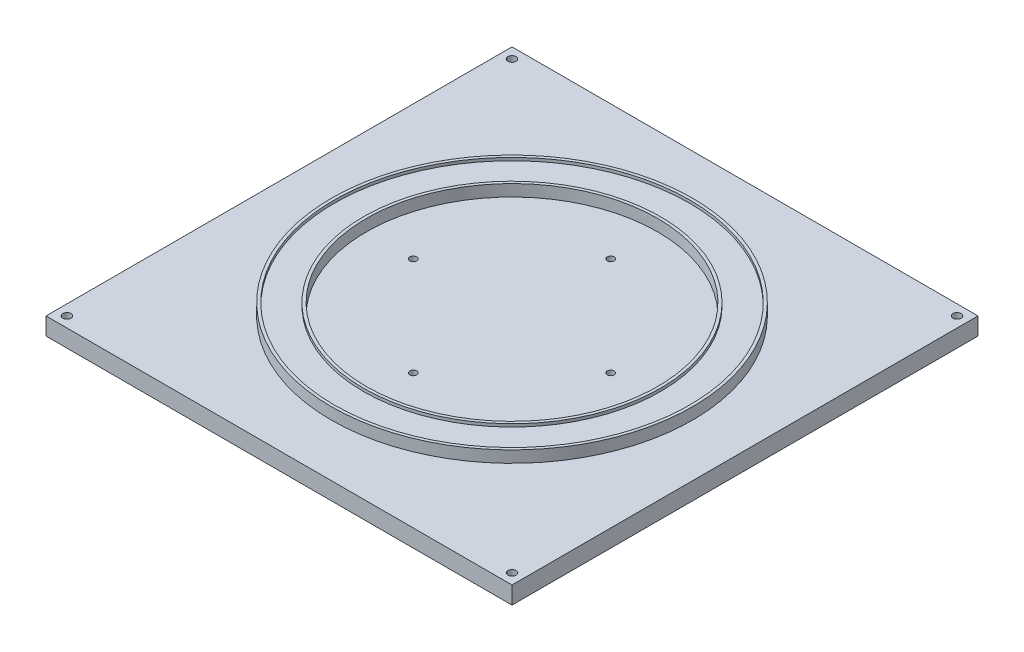
ISO-10303-21;
HEADER;
FILE_DESCRIPTION(('STEP AP214'),'2;1');
FILE_NAME('part.step','',(''),(''),'','','');
FILE_SCHEMA(('AUTOMOTIVE_DESIGN { 1 0 10303 214 1 1 1 1 }'));
ENDSEC;
DATA;
#1=APPLICATION_CONTEXT('core data for automotive mechanical design processes');
#2=APPLICATION_PROTOCOL_DEFINITION('international standard','automotive_design',2000,#1);
#3=PRODUCT_CONTEXT('',#1,'mechanical');
#4=PRODUCT('Part','Part','',(#3));
#5=PRODUCT_RELATED_PRODUCT_CATEGORY('part','',(#4));
#6=PRODUCT_DEFINITION_FORMATION('','',#4);
#7=PRODUCT_DEFINITION_CONTEXT('part definition',#1,'design');
#8=PRODUCT_DEFINITION('design','',#6,#7);
#9=PRODUCT_DEFINITION_SHAPE('','',#8);
#10=(LENGTH_UNIT() NAMED_UNIT(*) SI_UNIT(.MILLI.,.METRE.));
#11=(NAMED_UNIT(*) PLANE_ANGLE_UNIT() SI_UNIT($,.RADIAN.));
#12=(NAMED_UNIT(*) SI_UNIT($,.STERADIAN.) SOLID_ANGLE_UNIT());
#13=UNCERTAINTY_MEASURE_WITH_UNIT(LENGTH_MEASURE(1.E-05),#10,'distance_accuracy_value','');
#14=(GEOMETRIC_REPRESENTATION_CONTEXT(3) GLOBAL_UNCERTAINTY_ASSIGNED_CONTEXT((#13)) GLOBAL_UNIT_ASSIGNED_CONTEXT((#10,
#11,#12)) REPRESENTATION_CONTEXT('',''));
#15=CARTESIAN_POINT('',(0.,0.,0.));
#16=DIRECTION('',(0.,0.,1.));
#17=DIRECTION('',(1.,0.,0.));
#18=AXIS2_PLACEMENT_3D('',#15,#16,#17);
#19=CARTESIAN_POINT('',(0.,35.,0.));
#20=DIRECTION('',(0.,1.,0.));
#21=DIRECTION('',(0.,0.,1.));
#22=AXIS2_PLACEMENT_3D('',#19,#20,#21);
#23=PLANE('',#22);
#24=CARTESIAN_POINT('',(0.,35.,0.));
#25=DIRECTION('',(0.,1.,0.));
#26=DIRECTION('',(0.,0.,1.));
#27=AXIS2_PLACEMENT_3D('',#24,#25,#26);
#28=CIRCLE('',#27,250.);
#29=CARTESIAN_POINT('',(0.,35.,250.));
#30=VERTEX_POINT('',#29);
#31=EDGE_CURVE('E190',#30,#30,#28,.T.);
#32=ORIENTED_EDGE('',*,*,#31,.F.);
#33=EDGE_LOOP('',(#32));
#34=FACE_BOUND('',#33,.T.);
#35=CARTESIAN_POINT('',(0.,35.,0.));
#36=DIRECTION('',(0.,1.,0.));
#37=DIRECTION('',(0.,0.,1.));
#38=AXIS2_PLACEMENT_3D('',#35,#36,#37);
#39=CIRCLE('',#38,255.);
#40=CARTESIAN_POINT('',(0.,35.,255.));
#41=VERTEX_POINT('',#40);
#42=EDGE_CURVE('E302',#41,#41,#39,.T.);
#43=ORIENTED_EDGE('',*,*,#42,.T.);
#44=EDGE_LOOP('',(#43));
#45=FACE_BOUND('',#44,.T.);
#46=ADVANCED_FACE('F39',(#34,#45),#23,.T.);
#47=CARTESIAN_POINT('',(0.,15.,0.));
#48=DIRECTION('',(0.,1.,0.));
#49=DIRECTION('',(0.,0.,1.));
#50=AXIS2_PLACEMENT_3D('',#47,#48,#49);
#51=PLANE('',#50);
#52=CARTESIAN_POINT('',(-169.5,15.,1.11022302462516E-12));
#53=DIRECTION('',(0.,1.,0.));
#54=DIRECTION('',(0.,0.,-1.));
#55=AXIS2_PLACEMENT_3D('',#52,#53,#54);
#56=CIRCLE('',#55,5.99999999999995);
#57=CARTESIAN_POINT('',(-169.5,15.,-5.99999999999884));
#58=VERTEX_POINT('',#57);
#59=EDGE_CURVE('E181',#58,#58,#56,.T.);
#60=ORIENTED_EDGE('',*,*,#59,.F.);
#61=EDGE_LOOP('',(#60));
#62=FACE_BOUND('',#61,.T.);
#63=CARTESIAN_POINT('',(0.,15.,169.5));
#64=DIRECTION('',(0.,1.,0.));
#65=DIRECTION('',(0.,0.,-1.));
#66=AXIS2_PLACEMENT_3D('',#63,#64,#65);
#67=CIRCLE('',#66,6.);
#68=CARTESIAN_POINT('',(0.,15.,163.5));
#69=VERTEX_POINT('',#68);
#70=EDGE_CURVE('E214',#69,#69,#67,.T.);
#71=ORIENTED_EDGE('',*,*,#70,.F.);
#72=EDGE_LOOP('',(#71));
#73=FACE_BOUND('',#72,.T.);
#74=CARTESIAN_POINT('',(169.5,15.,0.));
#75=DIRECTION('',(0.,1.,0.));
#76=DIRECTION('',(0.,0.,1.));
#77=AXIS2_PLACEMENT_3D('',#74,#75,#76);
#78=CIRCLE('',#77,6.00000000000002);
#79=CARTESIAN_POINT('',(169.5,15.,6.00000000000002));
#80=VERTEX_POINT('',#79);
#81=EDGE_CURVE('E206',#80,#80,#78,.T.);
#82=ORIENTED_EDGE('',*,*,#81,.F.);
#83=EDGE_LOOP('',(#82));
#84=FACE_BOUND('',#83,.T.);
#85=CARTESIAN_POINT('',(0.,15.,-169.5));
#86=DIRECTION('',(0.,1.,0.));
#87=DIRECTION('',(0.,0.,1.));
#88=AXIS2_PLACEMENT_3D('',#85,#86,#87);
#89=CIRCLE('',#88,6.);
#90=CARTESIAN_POINT('',(0.,15.,-163.5));
#91=VERTEX_POINT('',#90);
#92=EDGE_CURVE('E198',#91,#91,#89,.T.);
#93=ORIENTED_EDGE('',*,*,#92,.F.);
#94=EDGE_LOOP('',(#93));
#95=FACE_BOUND('',#94,.T.);
#96=CARTESIAN_POINT('',(0.,15.,0.));
#97=DIRECTION('',(0.,1.,0.));
#98=DIRECTION('',(0.,0.,1.));
#99=AXIS2_PLACEMENT_3D('',#96,#97,#98);
#100=CIRCLE('',#99,250.);
#101=CARTESIAN_POINT('',(0.,15.,250.));
#102=VERTEX_POINT('',#101);
#103=EDGE_CURVE('E11',#102,#102,#100,.F.);
#104=ORIENTED_EDGE('',*,*,#103,.F.);
#105=EDGE_LOOP('',(#104));
#106=FACE_BOUND('',#105,.T.);
#107=ADVANCED_FACE('F144',(#62,#73,#84,#95,#106),#51,.T.);
#108=CARTESIAN_POINT('',(400.,15.,-400.));
#109=DIRECTION('',(-1.,0.,0.));
#110=DIRECTION('',(0.,0.,1.));
#111=AXIS2_PLACEMENT_3D('',#108,#109,#110);
#112=PLANE('',#111);
#113=DIRECTION('',(0.,0.,-1.));
#114=VECTOR('',#113,1.);
#115=CARTESIAN_POINT('',(400.,-15.,-400.));
#116=LINE('',#115,#114);
#117=CARTESIAN_POINT('',(400.,-15.,400.));
#118=VERTEX_POINT('',#117);
#119=CARTESIAN_POINT('',(400.,-15.,-400.));
#120=VERTEX_POINT('',#119);
#121=EDGE_CURVE('E111',#118,#120,#116,.T.);
#122=ORIENTED_EDGE('',*,*,#121,.T.);
#123=DIRECTION('',(0.,-1.,0.));
#124=VECTOR('',#123,1.);
#125=CARTESIAN_POINT('',(400.,15.,-400.));
#126=LINE('',#125,#124);
#127=CARTESIAN_POINT('',(400.,15.,-400.));
#128=VERTEX_POINT('',#127);
#129=EDGE_CURVE('E49',#128,#120,#126,.T.);
#130=ORIENTED_EDGE('',*,*,#129,.F.);
#131=DIRECTION('',(0.,0.,-1.));
#132=VECTOR('',#131,1.);
#133=CARTESIAN_POINT('',(400.,15.,-400.));
#134=LINE('',#133,#132);
#135=CARTESIAN_POINT('',(400.,15.,400.));
#136=VERTEX_POINT('',#135);
#137=EDGE_CURVE('E93',#136,#128,#134,.T.);
#138=ORIENTED_EDGE('',*,*,#137,.F.);
#139=DIRECTION('',(0.,-1.,0.));
#140=VECTOR('',#139,1.);
#141=CARTESIAN_POINT('',(400.,15.,400.));
#142=LINE('',#141,#140);
#143=EDGE_CURVE('E107',#136,#118,#142,.T.);
#144=ORIENTED_EDGE('',*,*,#143,.T.);
#145=EDGE_LOOP('',(#122,#130,#138,#144));
#146=FACE_BOUND('',#145,.T.);
#147=ADVANCED_FACE('F41',(#146),#112,.F.);
#148=CARTESIAN_POINT('',(-400.,15.,-400.));
#149=DIRECTION('',(0.,0.,1.));
#150=DIRECTION('',(1.,0.,0.));
#151=AXIS2_PLACEMENT_3D('',#148,#149,#150);
#152=PLANE('',#151);
#153=DIRECTION('',(-1.,0.,0.));
#154=VECTOR('',#153,1.);
#155=CARTESIAN_POINT('',(-400.,-15.,-400.));
#156=LINE('',#155,#154);
#157=CARTESIAN_POINT('',(-400.,-15.,-400.));
#158=VERTEX_POINT('',#157);
#159=EDGE_CURVE('E99',#120,#158,#156,.T.);
#160=ORIENTED_EDGE('',*,*,#159,.T.);
#161=DIRECTION('',(0.,-1.,0.));
#162=VECTOR('',#161,1.);
#163=CARTESIAN_POINT('',(-400.,15.,-400.));
#164=LINE('',#163,#162);
#165=CARTESIAN_POINT('',(-400.,15.,-400.));
#166=VERTEX_POINT('',#165);
#167=EDGE_CURVE('E97',#166,#158,#164,.T.);
#168=ORIENTED_EDGE('',*,*,#167,.F.);
#169=DIRECTION('',(-1.,0.,0.));
#170=VECTOR('',#169,1.);
#171=CARTESIAN_POINT('',(-400.,15.,-400.));
#172=LINE('',#171,#170);
#173=EDGE_CURVE('E88',#128,#166,#172,.T.);
#174=ORIENTED_EDGE('',*,*,#173,.F.);
#175=ORIENTED_EDGE('',*,*,#129,.T.);
#176=EDGE_LOOP('',(#160,#168,#174,#175));
#177=FACE_BOUND('',#176,.T.);
#178=ADVANCED_FACE('F98',(#177),#152,.F.);
#179=CARTESIAN_POINT('',(-400.,15.,-400.));
#180=DIRECTION('',(1.,0.,0.));
#181=DIRECTION('',(0.,0.,-1.));
#182=AXIS2_PLACEMENT_3D('',#179,#180,#181);
#183=PLANE('',#182);
#184=DIRECTION('',(0.,0.,1.));
#185=VECTOR('',#184,1.);
#186=CARTESIAN_POINT('',(-400.,-15.,-400.));
#187=LINE('',#186,#185);
#188=CARTESIAN_POINT('',(-400.,-15.,400.));
#189=VERTEX_POINT('',#188);
#190=EDGE_CURVE('E74',#158,#189,#187,.T.);
#191=ORIENTED_EDGE('',*,*,#190,.T.);
#192=DIRECTION('',(0.,-1.,0.));
#193=VECTOR('',#192,1.);
#194=CARTESIAN_POINT('',(-400.,15.,400.));
#195=LINE('',#194,#193);
#196=CARTESIAN_POINT('',(-400.,15.,400.));
#197=VERTEX_POINT('',#196);
#198=EDGE_CURVE('E101',#197,#189,#195,.T.);
#199=ORIENTED_EDGE('',*,*,#198,.F.);
#200=DIRECTION('',(0.,0.,1.));
#201=VECTOR('',#200,1.);
#202=CARTESIAN_POINT('',(-400.,15.,-400.));
#203=LINE('',#202,#201);
#204=EDGE_CURVE('E91',#166,#197,#203,.T.);
#205=ORIENTED_EDGE('',*,*,#204,.F.);
#206=ORIENTED_EDGE('',*,*,#167,.T.);
#207=EDGE_LOOP('',(#191,#199,#205,#206));
#208=FACE_BOUND('',#207,.T.);
#209=ADVANCED_FACE('F103',(#208),#183,.F.);
#210=CARTESIAN_POINT('',(-400.,15.,400.));
#211=DIRECTION('',(0.,0.,-1.));
#212=DIRECTION('',(-1.,0.,0.));
#213=AXIS2_PLACEMENT_3D('',#210,#211,#212);
#214=PLANE('',#213);
#215=DIRECTION('',(1.,0.,0.));
#216=VECTOR('',#215,1.);
#217=CARTESIAN_POINT('',(-400.,-15.,400.));
#218=LINE('',#217,#216);
#219=EDGE_CURVE('E80',#189,#118,#218,.T.);
#220=ORIENTED_EDGE('',*,*,#219,.T.);
#221=ORIENTED_EDGE('',*,*,#143,.F.);
#222=DIRECTION('',(1.,0.,0.));
#223=VECTOR('',#222,1.);
#224=CARTESIAN_POINT('',(-400.,15.,400.));
#225=LINE('',#224,#223);
#226=EDGE_CURVE('E57',#197,#136,#225,.T.);
#227=ORIENTED_EDGE('',*,*,#226,.F.);
#228=ORIENTED_EDGE('',*,*,#198,.T.);
#229=EDGE_LOOP('',(#220,#221,#227,#228));
#230=FACE_BOUND('',#229,.T.);
#231=ADVANCED_FACE('F141',(#230),#214,.F.);
#232=CARTESIAN_POINT('',(-382.,15.,382.));
#233=DIRECTION('',(0.,1.,0.));
#234=DIRECTION('',(0.,0.,-1.));
#235=AXIS2_PLACEMENT_3D('',#232,#233,#234);
#236=CIRCLE('',#235,6.99999999999999);
#237=CARTESIAN_POINT('',(-382.,15.,375.));
#238=VERTEX_POINT('',#237);
#239=EDGE_CURVE('E294',#238,#238,#236,.T.);
#240=ORIENTED_EDGE('',*,*,#239,.F.);
#241=EDGE_LOOP('',(#240));
#242=FACE_BOUND('',#241,.T.);
#243=CARTESIAN_POINT('',(381.999999999997,15.,382.000000000003));
#244=DIRECTION('',(0.,1.,0.));
#245=DIRECTION('',(0.,0.,1.));
#246=AXIS2_PLACEMENT_3D('',#243,#244,#245);
#247=CIRCLE('',#246,7.0000000000001);
#248=CARTESIAN_POINT('',(381.999999999997,15.,389.000000000003));
#249=VERTEX_POINT('',#248);
#250=EDGE_CURVE('E285',#249,#249,#247,.T.);
#251=ORIENTED_EDGE('',*,*,#250,.F.);
#252=EDGE_LOOP('',(#251));
#253=FACE_BOUND('',#252,.T.);
#254=CARTESIAN_POINT('',(381.999999999997,15.,-382.000000000003));
#255=DIRECTION('',(0.,1.,0.));
#256=DIRECTION('',(0.,0.,-1.));
#257=AXIS2_PLACEMENT_3D('',#254,#255,#256);
#258=CIRCLE('',#257,7.0000000000001);
#259=CARTESIAN_POINT('',(381.999999999997,15.,-389.000000000003));
#260=VERTEX_POINT('',#259);
#261=EDGE_CURVE('E275',#260,#260,#258,.T.);
#262=ORIENTED_EDGE('',*,*,#261,.F.);
#263=EDGE_LOOP('',(#262));
#264=FACE_BOUND('',#263,.T.);
#265=CARTESIAN_POINT('',(-382.,15.,-382.));
#266=DIRECTION('',(0.,1.,0.));
#267=DIRECTION('',(0.,0.,1.));
#268=AXIS2_PLACEMENT_3D('',#265,#266,#267);
#269=CIRCLE('',#268,6.99999999999999);
#270=CARTESIAN_POINT('',(-382.,15.,-375.));
#271=VERTEX_POINT('',#270);
#272=EDGE_CURVE('E282',#271,#271,#269,.T.);
#273=ORIENTED_EDGE('',*,*,#272,.F.);
#274=EDGE_LOOP('',(#273));
#275=FACE_BOUND('',#274,.T.);
#276=CARTESIAN_POINT('',(0.,15.,0.));
#277=DIRECTION('',(0.,1.,0.));
#278=DIRECTION('',(0.,0.,1.));
#279=AXIS2_PLACEMENT_3D('',#276,#277,#278);
#280=CIRCLE('',#279,310.);
#281=CARTESIAN_POINT('',(0.,15.,310.));
#282=VERTEX_POINT('',#281);
#283=EDGE_CURVE('E182',#282,#282,#280,.T.);
#284=ORIENTED_EDGE('',*,*,#283,.F.);
#285=EDGE_LOOP('',(#284));
#286=FACE_BOUND('',#285,.T.);
#287=ORIENTED_EDGE('',*,*,#137,.T.);
#288=ORIENTED_EDGE('',*,*,#173,.T.);
#289=ORIENTED_EDGE('',*,*,#204,.T.);
#290=ORIENTED_EDGE('',*,*,#226,.T.);
#291=EDGE_LOOP('',(#287,#288,#289,#290));
#292=FACE_BOUND('',#291,.T.);
#293=ADVANCED_FACE('F89',(#242,#253,#264,#275,#286,#292),#51,.T.);
#294=CARTESIAN_POINT('',(0.,-15.,0.));
#295=DIRECTION('',(0.,1.,0.));
#296=DIRECTION('',(0.,0.,1.));
#297=AXIS2_PLACEMENT_3D('',#294,#295,#296);
#298=PLANE('',#297);
#299=CARTESIAN_POINT('',(-382.,-15.,382.));
#300=DIRECTION('',(0.,1.,0.));
#301=DIRECTION('',(0.,0.,-1.));
#302=AXIS2_PLACEMENT_3D('',#299,#300,#301);
#303=CIRCLE('',#302,6.99999999999999);
#304=CARTESIAN_POINT('',(-382.,-15.,375.));
#305=VERTEX_POINT('',#304);
#306=EDGE_CURVE('E291',#305,#305,#303,.T.);
#307=ORIENTED_EDGE('',*,*,#306,.T.);
#308=EDGE_LOOP('',(#307));
#309=FACE_BOUND('',#308,.T.);
#310=CARTESIAN_POINT('',(381.999999999997,-15.,382.000000000003));
#311=DIRECTION('',(0.,1.,0.));
#312=DIRECTION('',(0.,0.,1.));
#313=AXIS2_PLACEMENT_3D('',#310,#311,#312);
#314=CIRCLE('',#313,7.0000000000001);
#315=CARTESIAN_POINT('',(381.999999999997,-15.,389.000000000003));
#316=VERTEX_POINT('',#315);
#317=EDGE_CURVE('E278',#316,#316,#314,.T.);
#318=ORIENTED_EDGE('',*,*,#317,.T.);
#319=EDGE_LOOP('',(#318));
#320=FACE_BOUND('',#319,.T.);
#321=CARTESIAN_POINT('',(381.999999999997,-15.,-382.000000000003));
#322=DIRECTION('',(0.,1.,0.));
#323=DIRECTION('',(0.,0.,-1.));
#324=AXIS2_PLACEMENT_3D('',#321,#322,#323);
#325=CIRCLE('',#324,7.0000000000001);
#326=CARTESIAN_POINT('',(381.999999999997,-15.,-389.000000000003));
#327=VERTEX_POINT('',#326);
#328=EDGE_CURVE('E272',#327,#327,#325,.T.);
#329=ORIENTED_EDGE('',*,*,#328,.T.);
#330=EDGE_LOOP('',(#329));
#331=FACE_BOUND('',#330,.T.);
#332=CARTESIAN_POINT('',(-382.,-15.,-382.));
#333=DIRECTION('',(0.,1.,0.));
#334=DIRECTION('',(0.,0.,1.));
#335=AXIS2_PLACEMENT_3D('',#332,#333,#334);
#336=CIRCLE('',#335,6.99999999999999);
#337=CARTESIAN_POINT('',(-382.,-15.,-375.));
#338=VERTEX_POINT('',#337);
#339=EDGE_CURVE('E298',#338,#338,#336,.T.);
#340=ORIENTED_EDGE('',*,*,#339,.T.);
#341=EDGE_LOOP('',(#340));
#342=FACE_BOUND('',#341,.T.);
#343=CARTESIAN_POINT('',(0.,-15.,-169.5));
#344=DIRECTION('',(0.,1.,0.));
#345=DIRECTION('',(0.,0.,1.));
#346=AXIS2_PLACEMENT_3D('',#343,#344,#345);
#347=CIRCLE('',#346,6.);
#348=CARTESIAN_POINT('',(0.,-15.,-163.5));
#349=VERTEX_POINT('',#348);
#350=EDGE_CURVE('E115',#349,#349,#347,.T.);
#351=ORIENTED_EDGE('',*,*,#350,.T.);
#352=EDGE_LOOP('',(#351));
#353=FACE_BOUND('',#352,.T.);
#354=CARTESIAN_POINT('',(169.5,-15.,0.));
#355=DIRECTION('',(0.,1.,0.));
#356=DIRECTION('',(0.,0.,1.));
#357=AXIS2_PLACEMENT_3D('',#354,#355,#356);
#358=CIRCLE('',#357,6.00000000000002);
#359=CARTESIAN_POINT('',(169.5,-15.,6.00000000000002));
#360=VERTEX_POINT('',#359);
#361=EDGE_CURVE('E202',#360,#360,#358,.T.);
#362=ORIENTED_EDGE('',*,*,#361,.T.);
#363=EDGE_LOOP('',(#362));
#364=FACE_BOUND('',#363,.T.);
#365=CARTESIAN_POINT('',(0.,-15.,169.5));
#366=DIRECTION('',(0.,1.,0.));
#367=DIRECTION('',(0.,0.,-1.));
#368=AXIS2_PLACEMENT_3D('',#365,#366,#367);
#369=CIRCLE('',#368,6.);
#370=CARTESIAN_POINT('',(0.,-15.,163.5));
#371=VERTEX_POINT('',#370);
#372=EDGE_CURVE('E210',#371,#371,#369,.T.);
#373=ORIENTED_EDGE('',*,*,#372,.T.);
#374=EDGE_LOOP('',(#373));
#375=FACE_BOUND('',#374,.T.);
#376=CARTESIAN_POINT('',(-169.5,-15.,1.11022302462516E-12));
#377=DIRECTION('',(0.,1.,0.));
#378=DIRECTION('',(0.,0.,-1.));
#379=AXIS2_PLACEMENT_3D('',#376,#377,#378);
#380=CIRCLE('',#379,5.99999999999995);
#381=CARTESIAN_POINT('',(-169.5,-15.,-5.99999999999884));
#382=VERTEX_POINT('',#381);
#383=EDGE_CURVE('E187',#382,#382,#380,.T.);
#384=ORIENTED_EDGE('',*,*,#383,.T.);
#385=EDGE_LOOP('',(#384));
#386=FACE_BOUND('',#385,.T.);
#387=ORIENTED_EDGE('',*,*,#121,.F.);
#388=ORIENTED_EDGE('',*,*,#219,.F.);
#389=ORIENTED_EDGE('',*,*,#190,.F.);
#390=ORIENTED_EDGE('',*,*,#159,.F.);
#391=EDGE_LOOP('',(#387,#388,#389,#390));
#392=FACE_BOUND('',#391,.T.);
#393=ADVANCED_FACE('F129',(#309,#320,#331,#342,#353,#364,#375,#386,#392),#298,.F.);
#394=CARTESIAN_POINT('',(-169.5,-15.,1.11022302462516E-12));
#395=DIRECTION('',(0.,1.,0.));
#396=DIRECTION('',(0.,0.,1.));
#397=AXIS2_PLACEMENT_3D('',#394,#395,#396);
#398=CYLINDRICAL_SURFACE('',#397,5.99999999999995);
#399=ORIENTED_EDGE('',*,*,#383,.F.);
#400=EDGE_LOOP('',(#399));
#401=FACE_BOUND('',#400,.T.);
#402=ORIENTED_EDGE('',*,*,#59,.T.);
#403=EDGE_LOOP('',(#402));
#404=FACE_BOUND('',#403,.T.);
#405=ADVANCED_FACE('F131',(#401,#404),#398,.F.);
#406=CARTESIAN_POINT('',(0.,-15.,169.5));
#407=DIRECTION('',(0.,1.,0.));
#408=DIRECTION('',(0.,0.,1.));
#409=AXIS2_PLACEMENT_3D('',#406,#407,#408);
#410=CYLINDRICAL_SURFACE('',#409,6.);
#411=ORIENTED_EDGE('',*,*,#372,.F.);
#412=EDGE_LOOP('',(#411));
#413=FACE_BOUND('',#412,.T.);
#414=ORIENTED_EDGE('',*,*,#70,.T.);
#415=EDGE_LOOP('',(#414));
#416=FACE_BOUND('',#415,.T.);
#417=ADVANCED_FACE('F138',(#413,#416),#410,.F.);
#418=CARTESIAN_POINT('',(169.5,-15.,0.));
#419=DIRECTION('',(0.,1.,0.));
#420=DIRECTION('',(0.,0.,1.));
#421=AXIS2_PLACEMENT_3D('',#418,#419,#420);
#422=CYLINDRICAL_SURFACE('',#421,6.00000000000002);
#423=ORIENTED_EDGE('',*,*,#361,.F.);
#424=EDGE_LOOP('',(#423));
#425=FACE_BOUND('',#424,.T.);
#426=ORIENTED_EDGE('',*,*,#81,.T.);
#427=EDGE_LOOP('',(#426));
#428=FACE_BOUND('',#427,.T.);
#429=ADVANCED_FACE('F170',(#425,#428),#422,.F.);
#430=CARTESIAN_POINT('',(0.,-15.,-169.5));
#431=DIRECTION('',(0.,1.,0.));
#432=DIRECTION('',(0.,0.,1.));
#433=AXIS2_PLACEMENT_3D('',#430,#431,#432);
#434=CYLINDRICAL_SURFACE('',#433,6.);
#435=ORIENTED_EDGE('',*,*,#350,.F.);
#436=EDGE_LOOP('',(#435));
#437=FACE_BOUND('',#436,.T.);
#438=ORIENTED_EDGE('',*,*,#92,.T.);
#439=EDGE_LOOP('',(#438));
#440=FACE_BOUND('',#439,.T.);
#441=ADVANCED_FACE('F162',(#437,#440),#434,.F.);
#442=CARTESIAN_POINT('',(0.,35.,0.));
#443=DIRECTION('',(0.,1.,0.));
#444=DIRECTION('',(0.,0.,1.));
#445=AXIS2_PLACEMENT_3D('',#442,#443,#444);
#446=CIRCLE('',#445,305.);
#447=CARTESIAN_POINT('',(0.,35.,305.));
#448=VERTEX_POINT('',#447);
#449=EDGE_CURVE('E176',#448,#448,#446,.T.);
#450=ORIENTED_EDGE('',*,*,#449,.F.);
#451=EDGE_LOOP('',(#450));
#452=FACE_BOUND('',#451,.T.);
#453=CARTESIAN_POINT('',(0.,35.,0.));
#454=DIRECTION('',(0.,1.,0.));
#455=DIRECTION('',(0.,0.,1.));
#456=AXIS2_PLACEMENT_3D('',#453,#454,#455);
#457=CIRCLE('',#456,310.);
#458=CARTESIAN_POINT('',(0.,35.,310.));
#459=VERTEX_POINT('',#458);
#460=EDGE_CURVE('E179',#459,#459,#457,.T.);
#461=ORIENTED_EDGE('',*,*,#460,.T.);
#462=EDGE_LOOP('',(#461));
#463=FACE_BOUND('',#462,.T.);
#464=ADVANCED_FACE('F151',(#452,#463),#23,.T.);
#465=CARTESIAN_POINT('',(0.,35.,0.));
#466=DIRECTION('',(0.,-1.,0.));
#467=DIRECTION('',(0.,0.,-1.));
#468=AXIS2_PLACEMENT_3D('',#465,#466,#467);
#469=CYLINDRICAL_SURFACE('',#468,310.);
#470=ORIENTED_EDGE('',*,*,#460,.F.);
#471=EDGE_LOOP('',(#470));
#472=FACE_BOUND('',#471,.T.);
#473=ORIENTED_EDGE('',*,*,#283,.T.);
#474=EDGE_LOOP('',(#473));
#475=FACE_BOUND('',#474,.T.);
#476=ADVANCED_FACE('F161',(#472,#475),#469,.T.);
#477=CARTESIAN_POINT('',(0.,35.,0.));
#478=DIRECTION('',(0.,-1.,0.));
#479=DIRECTION('',(0.,0.,-1.));
#480=AXIS2_PLACEMENT_3D('',#477,#478,#479);
#481=CYLINDRICAL_SURFACE('',#480,250.);
#482=ORIENTED_EDGE('',*,*,#31,.T.);
#483=EDGE_LOOP('',(#482));
#484=FACE_BOUND('',#483,.T.);
#485=ORIENTED_EDGE('',*,*,#103,.T.);
#486=EDGE_LOOP('',(#485));
#487=FACE_BOUND('',#486,.T.);
#488=ADVANCED_FACE('F168',(#484,#487),#481,.F.);
#489=CARTESIAN_POINT('',(0.,30.,0.));
#490=DIRECTION('',(0.,1.,0.));
#491=DIRECTION('',(0.,0.,1.));
#492=AXIS2_PLACEMENT_3D('',#489,#490,#491);
#493=CYLINDRICAL_SURFACE('',#492,305.);
#494=CARTESIAN_POINT('',(0.,30.,0.));
#495=DIRECTION('',(0.,1.,0.));
#496=DIRECTION('',(0.,0.,1.));
#497=AXIS2_PLACEMENT_3D('',#494,#495,#496);
#498=CIRCLE('',#497,305.);
#499=CARTESIAN_POINT('',(0.,30.,305.));
#500=VERTEX_POINT('',#499);
#501=EDGE_CURVE('E313',#500,#500,#498,.T.);
#502=ORIENTED_EDGE('',*,*,#501,.F.);
#503=EDGE_LOOP('',(#502));
#504=FACE_BOUND('',#503,.T.);
#505=ORIENTED_EDGE('',*,*,#449,.T.);
#506=EDGE_LOOP('',(#505));
#507=FACE_BOUND('',#506,.T.);
#508=ADVANCED_FACE('F235',(#504,#507),#493,.F.);
#509=CARTESIAN_POINT('',(0.,30.,0.));
#510=DIRECTION('',(0.,1.,0.));
#511=DIRECTION('',(0.,0.,1.));
#512=AXIS2_PLACEMENT_3D('',#509,#510,#511);
#513=PLANE('',#512);
#514=CARTESIAN_POINT('',(0.,30.,0.));
#515=DIRECTION('',(0.,1.,0.));
#516=DIRECTION('',(0.,0.,1.));
#517=AXIS2_PLACEMENT_3D('',#514,#515,#516);
#518=CIRCLE('',#517,255.);
#519=CARTESIAN_POINT('',(0.,30.,255.));
#520=VERTEX_POINT('',#519);
#521=EDGE_CURVE('E306',#520,#520,#518,.T.);
#522=ORIENTED_EDGE('',*,*,#521,.F.);
#523=EDGE_LOOP('',(#522));
#524=FACE_BOUND('',#523,.T.);
#525=ORIENTED_EDGE('',*,*,#501,.T.);
#526=EDGE_LOOP('',(#525));
#527=FACE_BOUND('',#526,.T.);
#528=ADVANCED_FACE('F240',(#524,#527),#513,.T.);
#529=CARTESIAN_POINT('',(0.,30.,0.));
#530=DIRECTION('',(0.,1.,0.));
#531=DIRECTION('',(0.,0.,1.));
#532=AXIS2_PLACEMENT_3D('',#529,#530,#531);
#533=CYLINDRICAL_SURFACE('',#532,255.);
#534=ORIENTED_EDGE('',*,*,#521,.T.);
#535=EDGE_LOOP('',(#534));
#536=FACE_BOUND('',#535,.T.);
#537=ORIENTED_EDGE('',*,*,#42,.F.);
#538=EDGE_LOOP('',(#537));
#539=FACE_BOUND('',#538,.T.);
#540=ADVANCED_FACE('F247',(#536,#539),#533,.T.);
#541=CARTESIAN_POINT('',(-382.,-15.,-382.));
#542=DIRECTION('',(0.,1.,0.));
#543=DIRECTION('',(0.,0.,1.));
#544=AXIS2_PLACEMENT_3D('',#541,#542,#543);
#545=CYLINDRICAL_SURFACE('',#544,6.99999999999999);
#546=ORIENTED_EDGE('',*,*,#339,.F.);
#547=EDGE_LOOP('',(#546));
#548=FACE_BOUND('',#547,.T.);
#549=ORIENTED_EDGE('',*,*,#272,.T.);
#550=EDGE_LOOP('',(#549));
#551=FACE_BOUND('',#550,.T.);
#552=ADVANCED_FACE('F251',(#548,#551),#545,.F.);
#553=CARTESIAN_POINT('',(381.999999999997,-15.,-382.000000000003));
#554=DIRECTION('',(0.,1.,0.));
#555=DIRECTION('',(0.,0.,1.));
#556=AXIS2_PLACEMENT_3D('',#553,#554,#555);
#557=CYLINDRICAL_SURFACE('',#556,7.0000000000001);
#558=ORIENTED_EDGE('',*,*,#328,.F.);
#559=EDGE_LOOP('',(#558));
#560=FACE_BOUND('',#559,.T.);
#561=ORIENTED_EDGE('',*,*,#261,.T.);
#562=EDGE_LOOP('',(#561));
#563=FACE_BOUND('',#562,.T.);
#564=ADVANCED_FACE('F255',(#560,#563),#557,.F.);
#565=CARTESIAN_POINT('',(381.999999999997,-15.,382.000000000003));
#566=DIRECTION('',(0.,1.,0.));
#567=DIRECTION('',(0.,0.,1.));
#568=AXIS2_PLACEMENT_3D('',#565,#566,#567);
#569=CYLINDRICAL_SURFACE('',#568,7.0000000000001);
#570=ORIENTED_EDGE('',*,*,#317,.F.);
#571=EDGE_LOOP('',(#570));
#572=FACE_BOUND('',#571,.T.);
#573=ORIENTED_EDGE('',*,*,#250,.T.);
#574=EDGE_LOOP('',(#573));
#575=FACE_BOUND('',#574,.T.);
#576=ADVANCED_FACE('F260',(#572,#575),#569,.F.);
#577=CARTESIAN_POINT('',(-382.,-15.,382.));
#578=DIRECTION('',(0.,1.,0.));
#579=DIRECTION('',(0.,0.,1.));
#580=AXIS2_PLACEMENT_3D('',#577,#578,#579);
#581=CYLINDRICAL_SURFACE('',#580,6.99999999999999);
#582=ORIENTED_EDGE('',*,*,#306,.F.);
#583=EDGE_LOOP('',(#582));
#584=FACE_BOUND('',#583,.T.);
#585=ORIENTED_EDGE('',*,*,#239,.T.);
#586=EDGE_LOOP('',(#585));
#587=FACE_BOUND('',#586,.T.);
#588=ADVANCED_FACE('F257',(#584,#587),#581,.F.);
#589=CLOSED_SHELL('',(#46,#107,#147,#178,#209,#231,#293,#393,#405,#417,#429,#441,#464,#476,#488,
#508,#528,#540,#552,#564,#576,#588));
#590=MANIFOLD_SOLID_BREP('B2',#589);
#591=ADVANCED_BREP_SHAPE_REPRESENTATION('',(#18,#590),#14);
#592=SHAPE_DEFINITION_REPRESENTATION(#9,#591);
ENDSEC;
END-ISO-10303-21;
